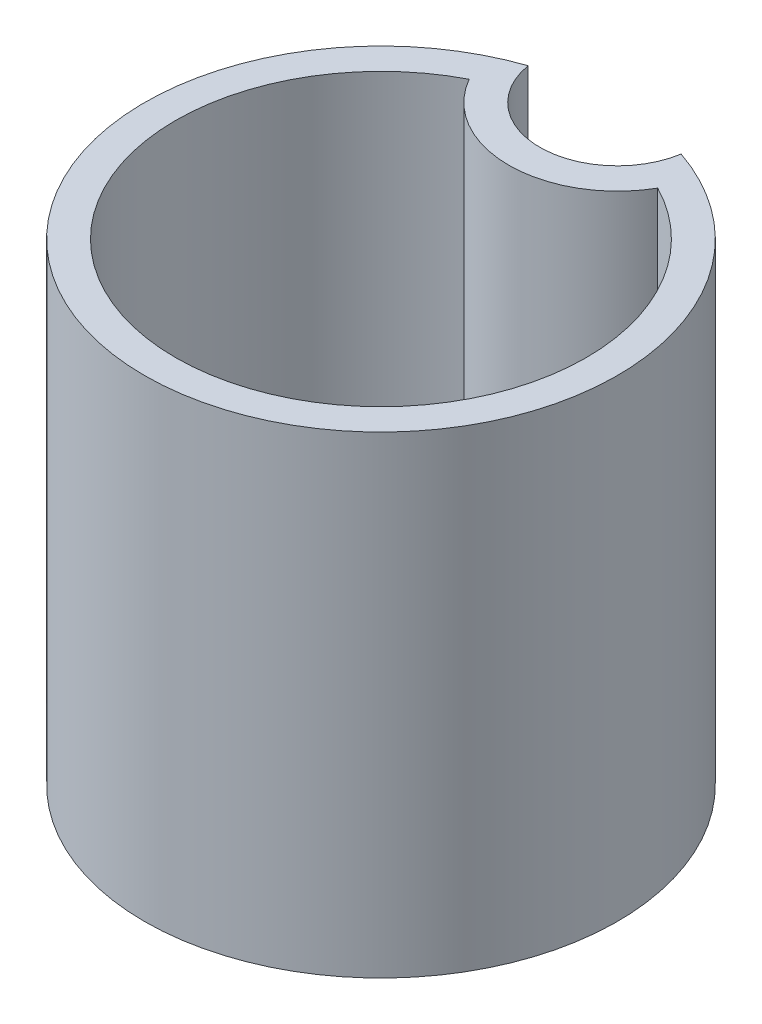
ISO-10303-21;
HEADER;
FILE_DESCRIPTION(('STEP AP214'),'2;1');
FILE_NAME('part.step','',(''),(''),'','','');
FILE_SCHEMA(('AUTOMOTIVE_DESIGN { 1 0 10303 214 1 1 1 1 }'));
ENDSEC;
DATA;
#1=APPLICATION_CONTEXT('core data for automotive mechanical design processes');
#2=APPLICATION_PROTOCOL_DEFINITION('international standard','automotive_design',2000,#1);
#3=PRODUCT_CONTEXT('',#1,'mechanical');
#4=PRODUCT('Part','Part','',(#3));
#5=PRODUCT_RELATED_PRODUCT_CATEGORY('part','',(#4));
#6=PRODUCT_DEFINITION_FORMATION('','',#4);
#7=PRODUCT_DEFINITION_CONTEXT('part definition',#1,'design');
#8=PRODUCT_DEFINITION('design','',#6,#7);
#9=PRODUCT_DEFINITION_SHAPE('','',#8);
#10=(LENGTH_UNIT() NAMED_UNIT(*) SI_UNIT(.MILLI.,.METRE.));
#11=(NAMED_UNIT(*) PLANE_ANGLE_UNIT() SI_UNIT($,.RADIAN.));
#12=(NAMED_UNIT(*) SI_UNIT($,.STERADIAN.) SOLID_ANGLE_UNIT());
#13=UNCERTAINTY_MEASURE_WITH_UNIT(LENGTH_MEASURE(1.E-05),#10,'distance_accuracy_value','');
#14=(GEOMETRIC_REPRESENTATION_CONTEXT(3) GLOBAL_UNCERTAINTY_ASSIGNED_CONTEXT((#13)) GLOBAL_UNIT_ASSIGNED_CONTEXT((#10,
#11,#12)) REPRESENTATION_CONTEXT('',''));
#15=CARTESIAN_POINT('',(0.,0.,0.));
#16=DIRECTION('',(0.,0.,1.));
#17=DIRECTION('',(1.,0.,0.));
#18=AXIS2_PLACEMENT_3D('',#15,#16,#17);
#19=CARTESIAN_POINT('',(0.,76.2,-38.1));
#20=DIRECTION('',(0.,-1.,0.));
#21=DIRECTION('',(0.,0.,-1.));
#22=AXIS2_PLACEMENT_3D('',#19,#20,#21);
#23=CYLINDRICAL_SURFACE('',#22,17.5);
#24=DIRECTION('',(0.,-1.,0.));
#25=VECTOR('',#24,1.);
#26=CARTESIAN_POINT('',(-15.189386987629,76.2,-29.4090551181102));
#27=LINE('',#26,#25);
#28=CARTESIAN_POINT('',(-15.189386987629,76.2,-29.4090551181102));
#29=VERTEX_POINT('',#28);
#30=CARTESIAN_POINT('',(-15.189386987629,5.00000000000003,-29.4090551181102));
#31=VERTEX_POINT('',#30);
#32=EDGE_CURVE('E42',#29,#31,#27,.T.);
#33=ORIENTED_EDGE('',*,*,#32,.T.);
#34=CARTESIAN_POINT('',(0.,5.,-38.1));
#35=DIRECTION('',(0.,1.,0.));
#36=DIRECTION('',(0.,0.,1.));
#37=AXIS2_PLACEMENT_3D('',#34,#35,#36);
#38=CIRCLE('',#37,17.5);
#39=CARTESIAN_POINT('',(15.189386987629,5.,-29.4090551181102));
#40=VERTEX_POINT('',#39);
#41=EDGE_CURVE('E86',#31,#40,#38,.T.);
#42=ORIENTED_EDGE('',*,*,#41,.T.);
#43=DIRECTION('',(0.,-1.,0.));
#44=VECTOR('',#43,1.);
#45=CARTESIAN_POINT('',(15.189386987629,76.2,-29.4090551181102));
#46=LINE('',#45,#44);
#47=CARTESIAN_POINT('',(15.189386987629,76.2,-29.4090551181102));
#48=VERTEX_POINT('',#47);
#49=EDGE_CURVE('E11',#48,#40,#46,.T.);
#50=ORIENTED_EDGE('',*,*,#49,.F.);
#51=CARTESIAN_POINT('',(0.,76.2,-38.1));
#52=DIRECTION('',(0.,1.,0.));
#53=DIRECTION('',(0.,0.,1.));
#54=AXIS2_PLACEMENT_3D('',#51,#52,#53);
#55=CIRCLE('',#54,17.5);
#56=EDGE_CURVE('E99',#29,#48,#55,.T.);
#57=ORIENTED_EDGE('',*,*,#56,.F.);
#58=EDGE_LOOP('',(#33,#42,#50,#57));
#59=FACE_BOUND('',#58,.T.);
#60=ADVANCED_FACE('F33',(#59),#23,.T.);
#61=CARTESIAN_POINT('',(0.,76.2,0.));
#62=DIRECTION('',(0.,-1.,0.));
#63=DIRECTION('',(0.,0.,-1.));
#64=AXIS2_PLACEMENT_3D('',#61,#62,#63);
#65=CYLINDRICAL_SURFACE('',#64,38.1);
#66=CARTESIAN_POINT('',(0.,0.,0.));
#67=DIRECTION('',(0.,1.,0.));
#68=DIRECTION('',(0.,0.,1.));
#69=AXIS2_PLACEMENT_3D('',#66,#67,#68);
#70=CIRCLE('',#69,38.1);
#71=CARTESIAN_POINT('',(-12.3306669524999,0.,-36.0494750656168));
#72=VERTEX_POINT('',#71);
#73=CARTESIAN_POINT('',(12.3306669524999,0.,-36.0494750656168));
#74=VERTEX_POINT('',#73);
#75=EDGE_CURVE('E90',#72,#74,#70,.T.);
#76=ORIENTED_EDGE('',*,*,#75,.T.);
#77=DIRECTION('',(0.,-1.,0.));
#78=VECTOR('',#77,1.);
#79=CARTESIAN_POINT('',(12.3306669524999,76.2,-36.0494750656168));
#80=LINE('',#79,#78);
#81=CARTESIAN_POINT('',(12.3306669524999,76.2,-36.0494750656168));
#82=VERTEX_POINT('',#81);
#83=EDGE_CURVE('E37',#82,#74,#80,.T.);
#84=ORIENTED_EDGE('',*,*,#83,.F.);
#85=CARTESIAN_POINT('',(0.,76.2,0.));
#86=DIRECTION('',(0.,1.,0.));
#87=DIRECTION('',(0.,0.,1.));
#88=AXIS2_PLACEMENT_3D('',#85,#86,#87);
#89=CIRCLE('',#88,38.1);
#90=CARTESIAN_POINT('',(-12.3306669524999,76.2,-36.0494750656168));
#91=VERTEX_POINT('',#90);
#92=EDGE_CURVE('E76',#91,#82,#89,.T.);
#93=ORIENTED_EDGE('',*,*,#92,.F.);
#94=DIRECTION('',(0.,-1.,0.));
#95=VECTOR('',#94,1.);
#96=CARTESIAN_POINT('',(-12.3306669524999,76.2,-36.0494750656168));
#97=LINE('',#96,#95);
#98=EDGE_CURVE('E70',#91,#72,#97,.T.);
#99=ORIENTED_EDGE('',*,*,#98,.T.);
#100=EDGE_LOOP('',(#76,#84,#93,#99));
#101=FACE_BOUND('',#100,.T.);
#102=ADVANCED_FACE('F35',(#101),#65,.T.);
#103=CARTESIAN_POINT('',(0.,76.2,-38.1));
#104=DIRECTION('',(0.,-1.,0.));
#105=DIRECTION('',(0.,0.,-1.));
#106=AXIS2_PLACEMENT_3D('',#103,#104,#105);
#107=CYLINDRICAL_SURFACE('',#106,12.5);
#108=CARTESIAN_POINT('',(0.,0.,-38.1));
#109=DIRECTION('',(0.,1.,0.));
#110=DIRECTION('',(0.,0.,1.));
#111=AXIS2_PLACEMENT_3D('',#108,#109,#110);
#112=CIRCLE('',#111,12.5);
#113=EDGE_CURVE('E92',#72,#74,#112,.T.);
#114=ORIENTED_EDGE('',*,*,#113,.F.);
#115=ORIENTED_EDGE('',*,*,#98,.F.);
#116=CARTESIAN_POINT('',(0.,76.2,-38.1));
#117=DIRECTION('',(0.,1.,0.));
#118=DIRECTION('',(0.,0.,1.));
#119=AXIS2_PLACEMENT_3D('',#116,#117,#118);
#120=CIRCLE('',#119,12.5);
#121=EDGE_CURVE('E96',#91,#82,#120,.T.);
#122=ORIENTED_EDGE('',*,*,#121,.T.);
#123=ORIENTED_EDGE('',*,*,#83,.T.);
#124=EDGE_LOOP('',(#114,#115,#122,#123));
#125=FACE_BOUND('',#124,.T.);
#126=ADVANCED_FACE('F106',(#125),#107,.F.);
#127=CARTESIAN_POINT('',(0.,76.2,0.));
#128=DIRECTION('',(0.,-1.,0.));
#129=DIRECTION('',(0.,0.,-1.));
#130=AXIS2_PLACEMENT_3D('',#127,#128,#129);
#131=CYLINDRICAL_SURFACE('',#130,33.1);
#132=CARTESIAN_POINT('',(0.,5.,0.));
#133=DIRECTION('',(0.,1.,0.));
#134=DIRECTION('',(0.,0.,1.));
#135=AXIS2_PLACEMENT_3D('',#132,#133,#134);
#136=CIRCLE('',#135,33.1);
#137=EDGE_CURVE('E49',#31,#40,#136,.T.);
#138=ORIENTED_EDGE('',*,*,#137,.F.);
#139=ORIENTED_EDGE('',*,*,#32,.F.);
#140=CARTESIAN_POINT('',(0.,76.2,0.));
#141=DIRECTION('',(0.,1.,0.));
#142=DIRECTION('',(0.,0.,1.));
#143=AXIS2_PLACEMENT_3D('',#140,#141,#142);
#144=CIRCLE('',#143,33.1);
#145=EDGE_CURVE('E83',#29,#48,#144,.T.);
#146=ORIENTED_EDGE('',*,*,#145,.T.);
#147=ORIENTED_EDGE('',*,*,#49,.T.);
#148=EDGE_LOOP('',(#138,#139,#146,#147));
#149=FACE_BOUND('',#148,.T.);
#150=ADVANCED_FACE('F81',(#149),#131,.F.);
#151=CARTESIAN_POINT('',(0.,76.2,0.));
#152=DIRECTION('',(0.,1.,0.));
#153=DIRECTION('',(0.,0.,1.));
#154=AXIS2_PLACEMENT_3D('',#151,#152,#153);
#155=PLANE('',#154);
#156=ORIENTED_EDGE('',*,*,#92,.T.);
#157=ORIENTED_EDGE('',*,*,#121,.F.);
#158=EDGE_LOOP('',(#156,#157));
#159=FACE_BOUND('',#158,.T.);
#160=ORIENTED_EDGE('',*,*,#56,.T.);
#161=ORIENTED_EDGE('',*,*,#145,.F.);
#162=EDGE_LOOP('',(#160,#161));
#163=FACE_BOUND('',#162,.T.);
#164=ADVANCED_FACE('F110',(#159,#163),#155,.T.);
#165=CARTESIAN_POINT('',(0.,0.,0.));
#166=DIRECTION('',(0.,1.,0.));
#167=DIRECTION('',(0.,0.,1.));
#168=AXIS2_PLACEMENT_3D('',#165,#166,#167);
#169=PLANE('',#168);
#170=ORIENTED_EDGE('',*,*,#75,.F.);
#171=ORIENTED_EDGE('',*,*,#113,.T.);
#172=EDGE_LOOP('',(#170,#171));
#173=FACE_BOUND('',#172,.T.);
#174=ADVANCED_FACE('F108',(#173),#169,.F.);
#175=CARTESIAN_POINT('',(0.,5.,0.));
#176=DIRECTION('',(0.,1.,0.));
#177=DIRECTION('',(0.,0.,1.));
#178=AXIS2_PLACEMENT_3D('',#175,#176,#177);
#179=PLANE('',#178);
#180=ORIENTED_EDGE('',*,*,#41,.F.);
#181=ORIENTED_EDGE('',*,*,#137,.T.);
#182=EDGE_LOOP('',(#180,#181));
#183=FACE_BOUND('',#182,.T.);
#184=ADVANCED_FACE('F89',(#183),#179,.T.);
#185=CLOSED_SHELL('',(#60,#102,#126,#150,#164,#174,#184));
#186=MANIFOLD_SOLID_BREP('B2',#185);
#187=ADVANCED_BREP_SHAPE_REPRESENTATION('',(#18,#186),#14);
#188=SHAPE_DEFINITION_REPRESENTATION(#9,#187);
ENDSEC;
END-ISO-10303-21;
